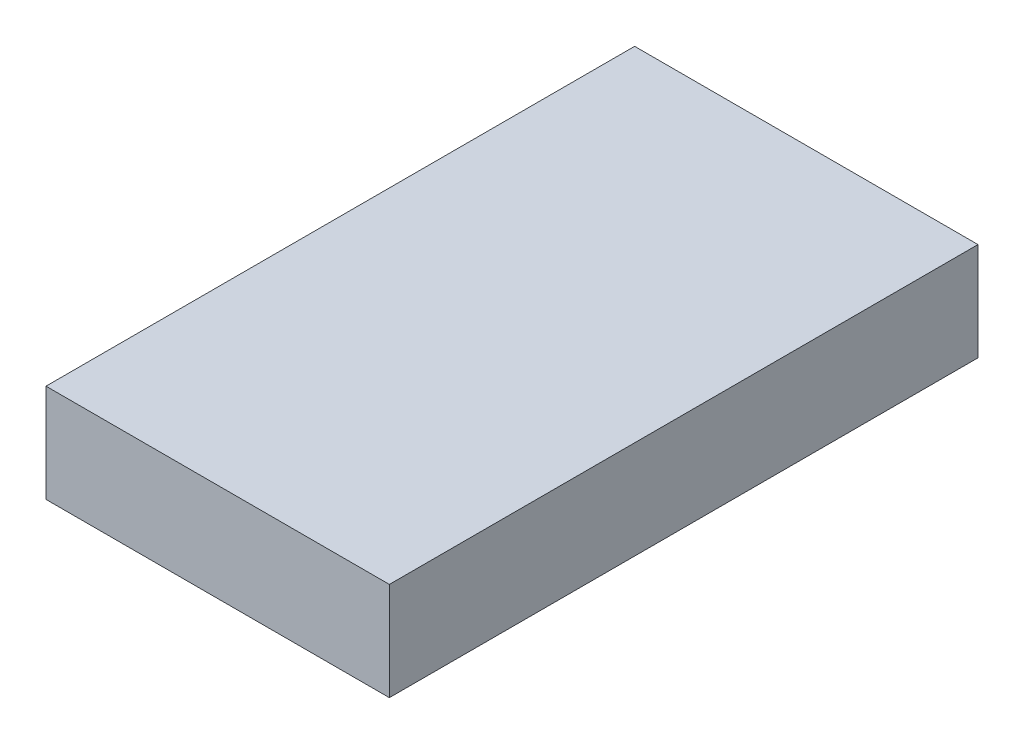
ISO-10303-21;
HEADER;
FILE_DESCRIPTION(('STEP AP214'),'2;1');
FILE_NAME('part.step','',(''),(''),'','','');
FILE_SCHEMA(('AUTOMOTIVE_DESIGN { 1 0 10303 214 1 1 1 1 }'));
ENDSEC;
DATA;
#1=APPLICATION_CONTEXT('core data for automotive mechanical design processes');
#2=APPLICATION_PROTOCOL_DEFINITION('international standard','automotive_design',2000,#1);
#3=PRODUCT_CONTEXT('',#1,'mechanical');
#4=PRODUCT('Part','Part','',(#3));
#5=PRODUCT_RELATED_PRODUCT_CATEGORY('part','',(#4));
#6=PRODUCT_DEFINITION_FORMATION('','',#4);
#7=PRODUCT_DEFINITION_CONTEXT('part definition',#1,'design');
#8=PRODUCT_DEFINITION('design','',#6,#7);
#9=PRODUCT_DEFINITION_SHAPE('','',#8);
#10=(LENGTH_UNIT() NAMED_UNIT(*) SI_UNIT(.MILLI.,.METRE.));
#11=(NAMED_UNIT(*) PLANE_ANGLE_UNIT() SI_UNIT($,.RADIAN.));
#12=(NAMED_UNIT(*) SI_UNIT($,.STERADIAN.) SOLID_ANGLE_UNIT());
#13=UNCERTAINTY_MEASURE_WITH_UNIT(LENGTH_MEASURE(1.E-05),#10,'distance_accuracy_value','');
#14=(GEOMETRIC_REPRESENTATION_CONTEXT(3) GLOBAL_UNCERTAINTY_ASSIGNED_CONTEXT((#13)) GLOBAL_UNIT_ASSIGNED_CONTEXT((#10,
#11,#12)) REPRESENTATION_CONTEXT('',''));
#15=CARTESIAN_POINT('',(0.,0.,0.));
#16=DIRECTION('',(0.,0.,1.));
#17=DIRECTION('',(1.,0.,0.));
#18=AXIS2_PLACEMENT_3D('',#15,#16,#17);
#19=CARTESIAN_POINT('',(0.,2.,0.));
#20=DIRECTION('',(1.,0.,0.));
#21=DIRECTION('',(0.,0.,-1.));
#22=AXIS2_PLACEMENT_3D('',#19,#20,#21);
#23=PLANE('',#22);
#24=DIRECTION('',(0.,0.,1.));
#25=VECTOR('',#24,1.);
#26=CARTESIAN_POINT('',(0.,0.,0.));
#27=LINE('',#26,#25);
#28=CARTESIAN_POINT('',(0.,0.,-12.));
#29=VERTEX_POINT('',#28);
#30=CARTESIAN_POINT('',(0.,0.,0.));
#31=VERTEX_POINT('',#30);
#32=EDGE_CURVE('E102',#29,#31,#27,.T.);
#33=ORIENTED_EDGE('',*,*,#32,.T.);
#34=DIRECTION('',(0.,-1.,0.));
#35=VECTOR('',#34,1.);
#36=CARTESIAN_POINT('',(0.,2.,0.));
#37=LINE('',#36,#35);
#38=CARTESIAN_POINT('',(0.,2.,0.));
#39=VERTEX_POINT('',#38);
#40=EDGE_CURVE('E11',#39,#31,#37,.T.);
#41=ORIENTED_EDGE('',*,*,#40,.F.);
#42=DIRECTION('',(0.,0.,1.));
#43=VECTOR('',#42,1.);
#44=CARTESIAN_POINT('',(0.,2.,0.));
#45=LINE('',#44,#43);
#46=CARTESIAN_POINT('',(0.,2.,-12.));
#47=VERTEX_POINT('',#46);
#48=EDGE_CURVE('E90',#47,#39,#45,.T.);
#49=ORIENTED_EDGE('',*,*,#48,.F.);
#50=DIRECTION('',(0.,-1.,0.));
#51=VECTOR('',#50,1.);
#52=CARTESIAN_POINT('',(0.,2.,-12.));
#53=LINE('',#52,#51);
#54=EDGE_CURVE('E98',#47,#29,#53,.T.);
#55=ORIENTED_EDGE('',*,*,#54,.T.);
#56=EDGE_LOOP('',(#33,#41,#49,#55));
#57=FACE_BOUND('',#56,.T.);
#58=ADVANCED_FACE('F39',(#57),#23,.F.);
#59=CARTESIAN_POINT('',(0.,2.,0.));
#60=DIRECTION('',(0.,0.,-1.));
#61=DIRECTION('',(-1.,0.,0.));
#62=AXIS2_PLACEMENT_3D('',#59,#60,#61);
#63=PLANE('',#62);
#64=DIRECTION('',(1.,0.,0.));
#65=VECTOR('',#64,1.);
#66=CARTESIAN_POINT('',(0.,0.,0.));
#67=LINE('',#66,#65);
#68=CARTESIAN_POINT('',(7.,0.,0.));
#69=VERTEX_POINT('',#68);
#70=EDGE_CURVE('E94',#31,#69,#67,.T.);
#71=ORIENTED_EDGE('',*,*,#70,.T.);
#72=DIRECTION('',(0.,-1.,0.));
#73=VECTOR('',#72,1.);
#74=CARTESIAN_POINT('',(7.,2.,0.));
#75=LINE('',#74,#73);
#76=CARTESIAN_POINT('',(7.,2.,0.));
#77=VERTEX_POINT('',#76);
#78=EDGE_CURVE('E47',#77,#69,#75,.T.);
#79=ORIENTED_EDGE('',*,*,#78,.F.);
#80=DIRECTION('',(1.,0.,0.));
#81=VECTOR('',#80,1.);
#82=CARTESIAN_POINT('',(0.,2.,0.));
#83=LINE('',#82,#81);
#84=EDGE_CURVE('E85',#39,#77,#83,.T.);
#85=ORIENTED_EDGE('',*,*,#84,.F.);
#86=ORIENTED_EDGE('',*,*,#40,.T.);
#87=EDGE_LOOP('',(#71,#79,#85,#86));
#88=FACE_BOUND('',#87,.T.);
#89=ADVANCED_FACE('F93',(#88),#63,.F.);
#90=CARTESIAN_POINT('',(7.,2.,0.));
#91=DIRECTION('',(-1.,0.,0.));
#92=DIRECTION('',(0.,0.,1.));
#93=AXIS2_PLACEMENT_3D('',#90,#91,#92);
#94=PLANE('',#93);
#95=DIRECTION('',(0.,0.,-1.));
#96=VECTOR('',#95,1.);
#97=CARTESIAN_POINT('',(7.,0.,0.));
#98=LINE('',#97,#96);
#99=CARTESIAN_POINT('',(7.,0.,-12.));
#100=VERTEX_POINT('',#99);
#101=EDGE_CURVE('E72',#69,#100,#98,.T.);
#102=ORIENTED_EDGE('',*,*,#101,.T.);
#103=DIRECTION('',(0.,-1.,0.));
#104=VECTOR('',#103,1.);
#105=CARTESIAN_POINT('',(7.,2.,-12.));
#106=LINE('',#105,#104);
#107=CARTESIAN_POINT('',(7.,2.,-12.));
#108=VERTEX_POINT('',#107);
#109=EDGE_CURVE('E95',#108,#100,#106,.T.);
#110=ORIENTED_EDGE('',*,*,#109,.F.);
#111=DIRECTION('',(0.,0.,-1.));
#112=VECTOR('',#111,1.);
#113=CARTESIAN_POINT('',(7.,2.,0.));
#114=LINE('',#113,#112);
#115=EDGE_CURVE('E88',#77,#108,#114,.T.);
#116=ORIENTED_EDGE('',*,*,#115,.F.);
#117=ORIENTED_EDGE('',*,*,#78,.T.);
#118=EDGE_LOOP('',(#102,#110,#116,#117));
#119=FACE_BOUND('',#118,.T.);
#120=ADVANCED_FACE('F96',(#119),#94,.F.);
#121=CARTESIAN_POINT('',(0.,2.,-12.));
#122=DIRECTION('',(0.,0.,1.));
#123=DIRECTION('',(1.,0.,0.));
#124=AXIS2_PLACEMENT_3D('',#121,#122,#123);
#125=PLANE('',#124);
#126=DIRECTION('',(-1.,0.,0.));
#127=VECTOR('',#126,1.);
#128=CARTESIAN_POINT('',(0.,0.,-12.));
#129=LINE('',#128,#127);
#130=EDGE_CURVE('E78',#100,#29,#129,.T.);
#131=ORIENTED_EDGE('',*,*,#130,.T.);
#132=ORIENTED_EDGE('',*,*,#54,.F.);
#133=DIRECTION('',(-1.,0.,0.));
#134=VECTOR('',#133,1.);
#135=CARTESIAN_POINT('',(0.,2.,-12.));
#136=LINE('',#135,#134);
#137=EDGE_CURVE('E55',#108,#47,#136,.T.);
#138=ORIENTED_EDGE('',*,*,#137,.F.);
#139=ORIENTED_EDGE('',*,*,#109,.T.);
#140=EDGE_LOOP('',(#131,#132,#138,#139));
#141=FACE_BOUND('',#140,.T.);
#142=ADVANCED_FACE('F109',(#141),#125,.F.);
#143=CARTESIAN_POINT('',(0.,2.,0.));
#144=DIRECTION('',(0.,-1.,0.));
#145=DIRECTION('',(0.,0.,-1.));
#146=AXIS2_PLACEMENT_3D('',#143,#144,#145);
#147=PLANE('',#146);
#148=ORIENTED_EDGE('',*,*,#48,.T.);
#149=ORIENTED_EDGE('',*,*,#84,.T.);
#150=ORIENTED_EDGE('',*,*,#115,.T.);
#151=ORIENTED_EDGE('',*,*,#137,.T.);
#152=EDGE_LOOP('',(#148,#149,#150,#151));
#153=FACE_BOUND('',#152,.T.);
#154=ADVANCED_FACE('F86',(#153),#147,.F.);
#155=CARTESIAN_POINT('',(0.,0.,0.));
#156=DIRECTION('',(0.,-1.,0.));
#157=DIRECTION('',(0.,0.,-1.));
#158=AXIS2_PLACEMENT_3D('',#155,#156,#157);
#159=PLANE('',#158);
#160=ORIENTED_EDGE('',*,*,#32,.F.);
#161=ORIENTED_EDGE('',*,*,#130,.F.);
#162=ORIENTED_EDGE('',*,*,#101,.F.);
#163=ORIENTED_EDGE('',*,*,#70,.F.);
#164=EDGE_LOOP('',(#160,#161,#162,#163));
#165=FACE_BOUND('',#164,.T.);
#166=ADVANCED_FACE('F112',(#165),#159,.T.);
#167=CLOSED_SHELL('',(#58,#89,#120,#142,#154,#166));
#168=MANIFOLD_SOLID_BREP('B2',#167);
#169=ADVANCED_BREP_SHAPE_REPRESENTATION('',(#18,#168),#14);
#170=SHAPE_DEFINITION_REPRESENTATION(#9,#169);
ENDSEC;
END-ISO-10303-21;
